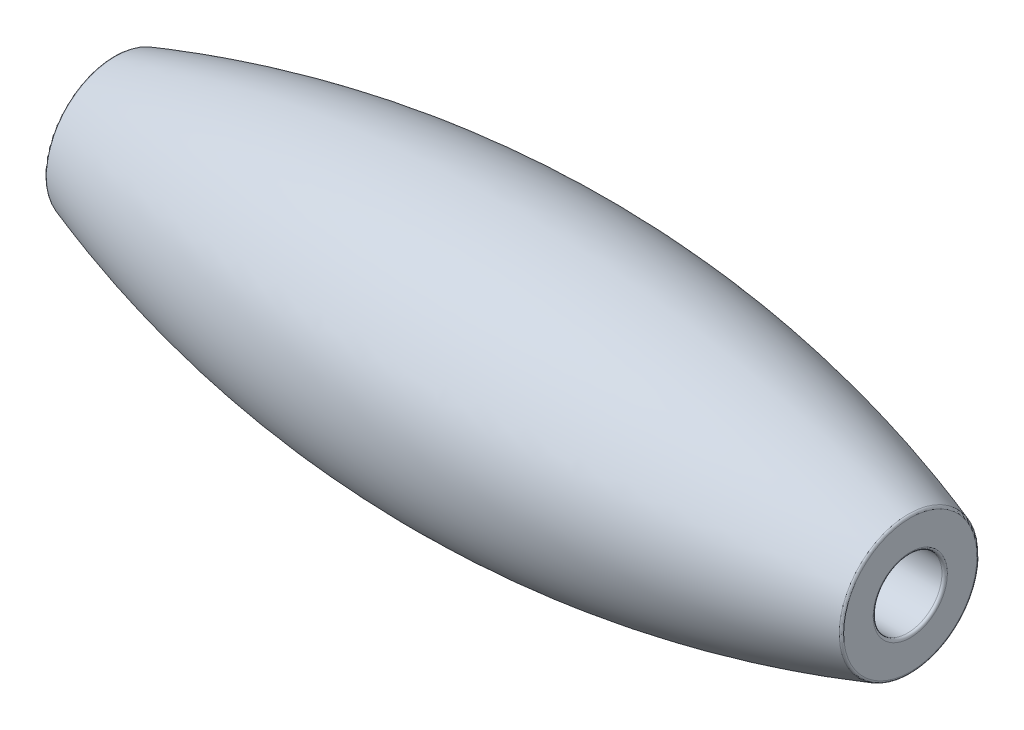
ISO-10303-21;
HEADER;
FILE_DESCRIPTION(('STEP AP214'),'2;1');
FILE_NAME('part.step','',(''),(''),'','','');
FILE_SCHEMA(('AUTOMOTIVE_DESIGN { 1 0 10303 214 1 1 1 1 }'));
ENDSEC;
DATA;
#1=APPLICATION_CONTEXT('core data for automotive mechanical design processes');
#2=APPLICATION_PROTOCOL_DEFINITION('international standard','automotive_design',2000,#1);
#3=PRODUCT_CONTEXT('',#1,'mechanical');
#4=PRODUCT('Part','Part','',(#3));
#5=PRODUCT_RELATED_PRODUCT_CATEGORY('part','',(#4));
#6=PRODUCT_DEFINITION_FORMATION('','',#4);
#7=PRODUCT_DEFINITION_CONTEXT('part definition',#1,'design');
#8=PRODUCT_DEFINITION('design','',#6,#7);
#9=PRODUCT_DEFINITION_SHAPE('','',#8);
#10=(LENGTH_UNIT() NAMED_UNIT(*) SI_UNIT(.MILLI.,.METRE.));
#11=(NAMED_UNIT(*) PLANE_ANGLE_UNIT() SI_UNIT($,.RADIAN.));
#12=(NAMED_UNIT(*) SI_UNIT($,.STERADIAN.) SOLID_ANGLE_UNIT());
#13=UNCERTAINTY_MEASURE_WITH_UNIT(LENGTH_MEASURE(1.E-05),#10,'distance_accuracy_value','');
#14=(GEOMETRIC_REPRESENTATION_CONTEXT(3) GLOBAL_UNCERTAINTY_ASSIGNED_CONTEXT((#13)) GLOBAL_UNIT_ASSIGNED_CONTEXT((#10,
#11,#12)) REPRESENTATION_CONTEXT('',''));
#15=CARTESIAN_POINT('',(0.,0.,0.));
#16=DIRECTION('',(0.,0.,1.));
#17=DIRECTION('',(1.,0.,0.));
#18=AXIS2_PLACEMENT_3D('',#15,#16,#17);
#19=CARTESIAN_POINT('',(0.,0.,0.));
#20=DIRECTION('',(1.,0.,0.));
#21=DIRECTION('',(0.,1.,0.));
#22=AXIS2_PLACEMENT_3D('',#19,#20,#21);
#23=CYLINDRICAL_SURFACE('',#22,3.2258);
#24=CARTESIAN_POINT('',(-37.084,0.,0.));
#25=DIRECTION('',(-1.,0.,0.));
#26=DIRECTION('',(0.,-1.,0.));
#27=AXIS2_PLACEMENT_3D('',#24,#25,#26);
#28=CIRCLE('',#27,3.2258);
#29=CARTESIAN_POINT('',(-37.084,-3.2258,0.));
#30=VERTEX_POINT('',#29);
#31=EDGE_CURVE('E242',#30,#30,#28,.F.);
#32=ORIENTED_EDGE('',*,*,#31,.F.);
#33=EDGE_LOOP('',(#32));
#34=FACE_BOUND('',#33,.T.);
#35=CARTESIAN_POINT('',(37.084,0.,0.));
#36=DIRECTION('',(1.,0.,0.));
#37=DIRECTION('',(0.,1.,0.));
#38=AXIS2_PLACEMENT_3D('',#35,#36,#37);
#39=CIRCLE('',#38,3.2258);
#40=CARTESIAN_POINT('',(37.084,3.2258,0.));
#41=VERTEX_POINT('',#40);
#42=EDGE_CURVE('E68',#41,#41,#39,.F.);
#43=ORIENTED_EDGE('',*,*,#42,.F.);
#44=EDGE_LOOP('',(#43));
#45=FACE_BOUND('',#44,.T.);
#46=ADVANCED_FACE('F17',(#34,#45),#23,.F.);
#47=CARTESIAN_POINT('',(-37.084,0.,0.));
#48=DIRECTION('',(-1.,0.,0.));
#49=DIRECTION('',(0.,-1.,0.));
#50=AXIS2_PLACEMENT_3D('',#47,#48,#49);
#51=TOROIDAL_SURFACE('',#50,3.4798,0.254);
#52=ORIENTED_EDGE('',*,*,#31,.T.);
#53=EDGE_LOOP('',(#52));
#54=FACE_BOUND('',#53,.T.);
#55=CARTESIAN_POINT('',(-37.338,0.,0.));
#56=DIRECTION('',(-1.,0.,0.));
#57=DIRECTION('',(0.,-1.,0.));
#58=AXIS2_PLACEMENT_3D('',#55,#56,#57);
#59=CIRCLE('',#58,3.4798);
#60=CARTESIAN_POINT('',(-37.338,3.4798,0.));
#61=VERTEX_POINT('',#60);
#62=CARTESIAN_POINT('',(-37.338,-3.4798,0.));
#63=VERTEX_POINT('',#62);
#64=EDGE_CURVE('E58',#61,#63,#59,.F.);
#65=ORIENTED_EDGE('',*,*,#64,.F.);
#66=CARTESIAN_POINT('',(-37.338,0.,0.));
#67=DIRECTION('',(-1.,0.,0.));
#68=DIRECTION('',(0.,1.,0.));
#69=AXIS2_PLACEMENT_3D('',#66,#67,#68);
#70=CIRCLE('',#69,3.4798);
#71=EDGE_CURVE('E56',#63,#61,#70,.F.);
#72=ORIENTED_EDGE('',*,*,#71,.F.);
#73=EDGE_LOOP('',(#65,#72));
#74=FACE_BOUND('',#73,.T.);
#75=ADVANCED_FACE('F60',(#54,#74),#51,.T.);
#76=CARTESIAN_POINT('',(37.084,0.,0.));
#77=DIRECTION('',(1.,0.,0.));
#78=DIRECTION('',(0.,1.,0.));
#79=AXIS2_PLACEMENT_3D('',#76,#77,#78);
#80=TOROIDAL_SURFACE('',#79,3.4798,0.254);
#81=ORIENTED_EDGE('',*,*,#42,.T.);
#82=EDGE_LOOP('',(#81));
#83=FACE_BOUND('',#82,.T.);
#84=CARTESIAN_POINT('',(37.338,0.,0.));
#85=DIRECTION('',(1.,0.,0.));
#86=DIRECTION('',(0.,1.,0.));
#87=AXIS2_PLACEMENT_3D('',#84,#85,#86);
#88=CIRCLE('',#87,3.4798);
#89=CARTESIAN_POINT('',(37.338,-3.4798,0.));
#90=VERTEX_POINT('',#89);
#91=CARTESIAN_POINT('',(37.338,3.4798,0.));
#92=VERTEX_POINT('',#91);
#93=EDGE_CURVE('E174',#90,#92,#88,.F.);
#94=ORIENTED_EDGE('',*,*,#93,.F.);
#95=CARTESIAN_POINT('',(37.338,0.,0.));
#96=DIRECTION('',(1.,0.,0.));
#97=DIRECTION('',(0.,-1.,0.));
#98=AXIS2_PLACEMENT_3D('',#95,#96,#97);
#99=CIRCLE('',#98,3.4798);
#100=EDGE_CURVE('E63',#92,#90,#99,.F.);
#101=ORIENTED_EDGE('',*,*,#100,.F.);
#102=EDGE_LOOP('',(#94,#101));
#103=FACE_BOUND('',#102,.T.);
#104=ADVANCED_FACE('F85',(#83,#103),#80,.T.);
#105=CARTESIAN_POINT('',(-37.338,0.,0.));
#106=DIRECTION('',(-1.,0.,0.));
#107=DIRECTION('',(0.,-1.,0.));
#108=AXIS2_PLACEMENT_3D('',#105,#106,#107);
#109=PLANE('',#108);
#110=CARTESIAN_POINT('',(-37.338,0.,0.));
#111=DIRECTION('',(1.,0.,0.));
#112=DIRECTION('',(0.,1.,0.));
#113=AXIS2_PLACEMENT_3D('',#110,#111,#112);
#114=CIRCLE('',#113,6.24835214318299);
#115=CARTESIAN_POINT('',(-37.338,6.24835214318299,0.));
#116=VERTEX_POINT('',#115);
#117=CARTESIAN_POINT('',(-37.338,-6.248352143183,0.));
#118=VERTEX_POINT('',#117);
#119=EDGE_CURVE('E120',#116,#118,#114,.T.);
#120=ORIENTED_EDGE('',*,*,#119,.F.);
#121=CARTESIAN_POINT('',(-37.338,0.,0.));
#122=DIRECTION('',(1.,0.,0.));
#123=DIRECTION('',(0.,-1.,0.));
#124=AXIS2_PLACEMENT_3D('',#121,#122,#123);
#125=CIRCLE('',#124,6.24835214318299);
#126=EDGE_CURVE('E108',#118,#116,#125,.T.);
#127=ORIENTED_EDGE('',*,*,#126,.F.);
#128=EDGE_LOOP('',(#120,#127));
#129=FACE_BOUND('',#128,.T.);
#130=ORIENTED_EDGE('',*,*,#71,.T.);
#131=ORIENTED_EDGE('',*,*,#64,.T.);
#132=EDGE_LOOP('',(#130,#131));
#133=FACE_BOUND('',#132,.T.);
#134=ADVANCED_FACE('F67',(#129,#133),#109,.T.);
#135=CARTESIAN_POINT('',(37.338,0.,0.));
#136=DIRECTION('',(1.,0.,0.));
#137=DIRECTION('',(0.,1.,0.));
#138=AXIS2_PLACEMENT_3D('',#135,#136,#137);
#139=PLANE('',#138);
#140=ORIENTED_EDGE('',*,*,#100,.T.);
#141=ORIENTED_EDGE('',*,*,#93,.T.);
#142=EDGE_LOOP('',(#140,#141));
#143=FACE_BOUND('',#142,.T.);
#144=CARTESIAN_POINT('',(37.338,0.,0.));
#145=DIRECTION('',(-1.,0.,0.));
#146=DIRECTION('',(0.,-1.,0.));
#147=AXIS2_PLACEMENT_3D('',#144,#145,#146);
#148=CIRCLE('',#147,6.24835214318298);
#149=CARTESIAN_POINT('',(37.338,-6.24835214318297,0.));
#150=VERTEX_POINT('',#149);
#151=CARTESIAN_POINT('',(37.338,6.24835214318298,0.));
#152=VERTEX_POINT('',#151);
#153=EDGE_CURVE('E144',#150,#152,#148,.T.);
#154=ORIENTED_EDGE('',*,*,#153,.F.);
#155=CARTESIAN_POINT('',(37.338,0.,0.));
#156=DIRECTION('',(-1.,0.,0.));
#157=DIRECTION('',(0.,1.,0.));
#158=AXIS2_PLACEMENT_3D('',#155,#156,#157);
#159=CIRCLE('',#158,6.24835214318298);
#160=EDGE_CURVE('E35',#152,#150,#159,.T.);
#161=ORIENTED_EDGE('',*,*,#160,.F.);
#162=EDGE_LOOP('',(#154,#161));
#163=FACE_BOUND('',#162,.T.);
#164=ADVANCED_FACE('F84',(#143,#163),#139,.T.);
#165=CARTESIAN_POINT('',(-37.084,0.,0.));
#166=DIRECTION('',(-1.,0.,0.));
#167=DIRECTION('',(0.,-1.,0.));
#168=AXIS2_PLACEMENT_3D('',#165,#166,#167);
#169=TOROIDAL_SURFACE('',#168,6.24835214318299,0.254);
#170=ORIENTED_EDGE('',*,*,#126,.T.);
#171=ORIENTED_EDGE('',*,*,#119,.T.);
#172=EDGE_LOOP('',(#170,#171));
#173=FACE_BOUND('',#172,.T.);
#174=CARTESIAN_POINT('',(-37.1665924276169,0.,0.));
#175=DIRECTION('',(1.,0.,0.));
#176=DIRECTION('',(0.,1.,0.));
#177=AXIS2_PLACEMENT_3D('',#174,#175,#176);
#178=CIRCLE('',#177,6.48854891855755);
#179=CARTESIAN_POINT('',(-37.1665924276169,6.48854891855755,0.));
#180=VERTEX_POINT('',#179);
#181=EDGE_CURVE('E27',#180,#180,#178,.T.);
#182=ORIENTED_EDGE('',*,*,#181,.F.);
#183=EDGE_LOOP('',(#182));
#184=FACE_BOUND('',#183,.T.);
#185=ADVANCED_FACE('F124',(#173,#184),#169,.T.);
#186=CARTESIAN_POINT('',(37.084,0.,0.));
#187=DIRECTION('',(1.,0.,0.));
#188=DIRECTION('',(0.,1.,0.));
#189=AXIS2_PLACEMENT_3D('',#186,#187,#188);
#190=TOROIDAL_SURFACE('',#189,6.24835214318298,0.254);
#191=ORIENTED_EDGE('',*,*,#160,.T.);
#192=ORIENTED_EDGE('',*,*,#153,.T.);
#193=EDGE_LOOP('',(#191,#192));
#194=FACE_BOUND('',#193,.T.);
#195=CARTESIAN_POINT('',(37.166592427617,0.,0.));
#196=DIRECTION('',(1.,0.,0.));
#197=DIRECTION('',(0.,1.,0.));
#198=AXIS2_PLACEMENT_3D('',#195,#196,#197);
#199=CIRCLE('',#198,6.48854891855754);
#200=CARTESIAN_POINT('',(37.166592427617,6.48854891855755,0.));
#201=VERTEX_POINT('',#200);
#202=EDGE_CURVE('E11',#201,#201,#199,.F.);
#203=ORIENTED_EDGE('',*,*,#202,.F.);
#204=EDGE_LOOP('',(#203));
#205=FACE_BOUND('',#204,.T.);
#206=ADVANCED_FACE('F134',(#194,#205),#190,.T.);
#207=CARTESIAN_POINT('',(0.,-101.6,0.));
#208=DIRECTION('',(0.,0.,1.));
#209=DIRECTION('',(0.,1.,0.));
#210=AXIS2_PLACEMENT_3D('',#207,#208,#209);
#211=CIRCLE('',#210,114.3);
#212=TRIMMED_CURVE('',#211,(PARAMETER_VALUE(-0.475882249660417)),
(PARAMETER_VALUE(0.475882249660417)),.T.,.PARAMETER.);
#213=CARTESIAN_POINT('',(0.,0.,0.));
#214=DIRECTION('',(1.,0.,0.));
#215=AXIS1_PLACEMENT('',#213,#214);
#216=SURFACE_OF_REVOLUTION('',#212,#215);
#217=ORIENTED_EDGE('',*,*,#202,.T.);
#218=EDGE_LOOP('',(#217));
#219=FACE_BOUND('',#218,.T.);
#220=ORIENTED_EDGE('',*,*,#181,.T.);
#221=EDGE_LOOP('',(#220));
#222=FACE_BOUND('',#221,.T.);
#223=ADVANCED_FACE('F254',(#219,#222),#216,.F.);
#224=CLOSED_SHELL('',(#46,#75,#104,#134,#164,#185,#206,#223));
#225=MANIFOLD_SOLID_BREP('B1',#224);
#226=ADVANCED_BREP_SHAPE_REPRESENTATION('',(#18,#225),#14);
#227=SHAPE_DEFINITION_REPRESENTATION(#9,#226);
ENDSEC;
END-ISO-10303-21;
